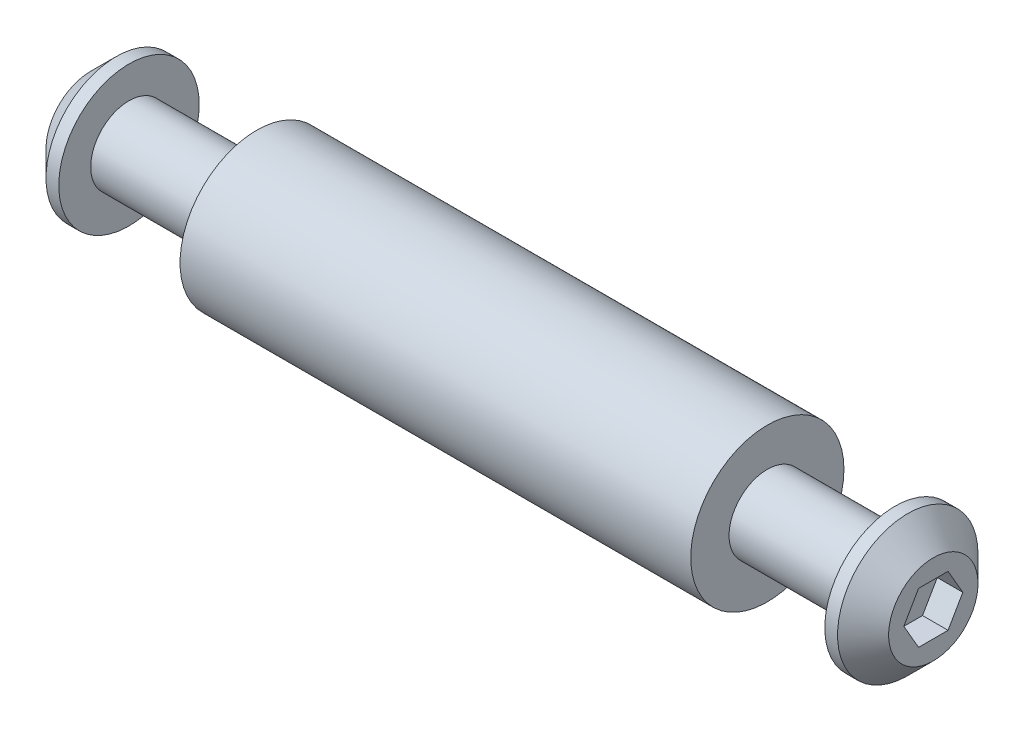
ISO-10303-21;
HEADER;
FILE_DESCRIPTION(('STEP AP214'),'2;1');
FILE_NAME('part.step','',(''),(''),'','','');
FILE_SCHEMA(('AUTOMOTIVE_DESIGN { 1 0 10303 214 1 1 1 1 }'));
ENDSEC;
DATA;
#1=APPLICATION_CONTEXT('core data for automotive mechanical design processes');
#2=APPLICATION_PROTOCOL_DEFINITION('international standard','automotive_design',2000,#1);
#3=PRODUCT_CONTEXT('',#1,'mechanical');
#4=PRODUCT('Part','Part','',(#3));
#5=PRODUCT_RELATED_PRODUCT_CATEGORY('part','',(#4));
#6=PRODUCT_DEFINITION_FORMATION('','',#4);
#7=PRODUCT_DEFINITION_CONTEXT('part definition',#1,'design');
#8=PRODUCT_DEFINITION('design','',#6,#7);
#9=PRODUCT_DEFINITION_SHAPE('','',#8);
#10=(LENGTH_UNIT() NAMED_UNIT(*) SI_UNIT(.MILLI.,.METRE.));
#11=(NAMED_UNIT(*) PLANE_ANGLE_UNIT() SI_UNIT($,.RADIAN.));
#12=(NAMED_UNIT(*) SI_UNIT($,.STERADIAN.) SOLID_ANGLE_UNIT());
#13=UNCERTAINTY_MEASURE_WITH_UNIT(LENGTH_MEASURE(1.E-05),#10,'distance_accuracy_value','');
#14=(GEOMETRIC_REPRESENTATION_CONTEXT(3) GLOBAL_UNCERTAINTY_ASSIGNED_CONTEXT((#13)) GLOBAL_UNIT_ASSIGNED_CONTEXT((#10,
#11,#12)) REPRESENTATION_CONTEXT('',''));
#15=CARTESIAN_POINT('',(0.,0.,0.));
#16=DIRECTION('',(0.,0.,1.));
#17=DIRECTION('',(1.,0.,0.));
#18=AXIS2_PLACEMENT_3D('',#15,#16,#17);
#19=CARTESIAN_POINT('',(-16.5,1.75,0.));
#20=DIRECTION('',(-1.,0.,0.));
#21=DIRECTION('',(0.,0.,1.));
#22=AXIS2_PLACEMENT_3D('',#19,#20,#21);
#23=PLANE('',#22);
#24=CARTESIAN_POINT('',(-16.5,0.,0.));
#25=DIRECTION('',(1.,0.,0.));
#26=DIRECTION('',(0.,0.,-1.));
#27=AXIS2_PLACEMENT_3D('',#24,#25,#26);
#28=CIRCLE('',#27,1.75);
#29=CARTESIAN_POINT('',(-16.5,0.,-1.75));
#30=VERTEX_POINT('',#29);
#31=EDGE_CURVE('E244',#30,#30,#28,.T.);
#32=ORIENTED_EDGE('',*,*,#31,.F.);
#33=EDGE_LOOP('',(#32));
#34=FACE_BOUND('',#33,.T.);
#35=DIRECTION('',(0.,0.866025403784439,-0.5));
#36=VECTOR('',#35,1.);
#37=CARTESIAN_POINT('',(-16.5,-1.,-0.577350269189626));
#38=LINE('',#37,#36);
#39=CARTESIAN_POINT('',(-16.5,-1.,-0.577350269189626));
#40=VERTEX_POINT('',#39);
#41=CARTESIAN_POINT('',(-16.5,0.,-1.15470053837925));
#42=VERTEX_POINT('',#41);
#43=EDGE_CURVE('E155',#40,#42,#38,.T.);
#44=ORIENTED_EDGE('',*,*,#43,.T.);
#45=DIRECTION('',(0.,0.866025403784439,0.5));
#46=VECTOR('',#45,1.);
#47=CARTESIAN_POINT('',(-16.5,0.,-1.15470053837925));
#48=LINE('',#47,#46);
#49=CARTESIAN_POINT('',(-16.5,1.,-0.577350269189626));
#50=VERTEX_POINT('',#49);
#51=EDGE_CURVE('E47',#42,#50,#48,.T.);
#52=ORIENTED_EDGE('',*,*,#51,.T.);
#53=DIRECTION('',(0.,0.,1.));
#54=VECTOR('',#53,1.);
#55=CARTESIAN_POINT('',(-16.5,1.,-0.577350269189626));
#56=LINE('',#55,#54);
#57=CARTESIAN_POINT('',(-16.5,1.,0.577350269189626));
#58=VERTEX_POINT('',#57);
#59=EDGE_CURVE('E142',#50,#58,#56,.T.);
#60=ORIENTED_EDGE('',*,*,#59,.T.);
#61=DIRECTION('',(0.,-0.866025403784438,0.5));
#62=VECTOR('',#61,1.);
#63=CARTESIAN_POINT('',(-16.5,1.,0.577350269189626));
#64=LINE('',#63,#62);
#65=CARTESIAN_POINT('',(-16.5,0.,1.15470053837925));
#66=VERTEX_POINT('',#65);
#67=EDGE_CURVE('E145',#58,#66,#64,.T.);
#68=ORIENTED_EDGE('',*,*,#67,.T.);
#69=DIRECTION('',(0.,-0.866025403784439,-0.5));
#70=VECTOR('',#69,1.);
#71=CARTESIAN_POINT('',(-16.5,0.,1.15470053837925));
#72=LINE('',#71,#70);
#73=CARTESIAN_POINT('',(-16.5,-1.,0.577350269189627));
#74=VERTEX_POINT('',#73);
#75=EDGE_CURVE('E160',#66,#74,#72,.T.);
#76=ORIENTED_EDGE('',*,*,#75,.T.);
#77=DIRECTION('',(0.,0.,-1.));
#78=VECTOR('',#77,1.);
#79=CARTESIAN_POINT('',(-16.5,-1.,0.577350269189627));
#80=LINE('',#79,#78);
#81=EDGE_CURVE('E157',#74,#40,#80,.T.);
#82=ORIENTED_EDGE('',*,*,#81,.T.);
#83=EDGE_LOOP('',(#44,#52,#60,#68,#76,#82));
#84=FACE_BOUND('',#83,.T.);
#85=ADVANCED_FACE('F32',(#34,#84),#23,.T.);
#86=CARTESIAN_POINT('',(15.,1.5,0.));
#87=DIRECTION('',(-1.,0.,0.));
#88=DIRECTION('',(0.,0.,1.));
#89=AXIS2_PLACEMENT_3D('',#86,#87,#88);
#90=PLANE('',#89);
#91=CARTESIAN_POINT('',(15.,0.,0.));
#92=DIRECTION('',(1.,0.,0.));
#93=DIRECTION('',(0.,0.,-1.));
#94=AXIS2_PLACEMENT_3D('',#91,#92,#93);
#95=CIRCLE('',#94,1.5);
#96=CARTESIAN_POINT('',(15.,0.,-1.5));
#97=VERTEX_POINT('',#96);
#98=EDGE_CURVE('E211',#97,#97,#95,.T.);
#99=ORIENTED_EDGE('',*,*,#98,.T.);
#100=EDGE_LOOP('',(#99));
#101=FACE_BOUND('',#100,.T.);
#102=CARTESIAN_POINT('',(15.,0.,0.));
#103=DIRECTION('',(1.,0.,0.));
#104=DIRECTION('',(0.,0.,-1.));
#105=AXIS2_PLACEMENT_3D('',#102,#103,#104);
#106=CIRCLE('',#105,2.75000000000004);
#107=CARTESIAN_POINT('',(15.,0.,-2.75000000000004));
#108=VERTEX_POINT('',#107);
#109=EDGE_CURVE('E11',#108,#108,#106,.T.);
#110=ORIENTED_EDGE('',*,*,#109,.F.);
#111=EDGE_LOOP('',(#110));
#112=FACE_BOUND('',#111,.T.);
#113=ADVANCED_FACE('F34',(#101,#112),#90,.T.);
#114=CARTESIAN_POINT('',(0.,0.,0.));
#115=DIRECTION('',(1.,0.,0.));
#116=DIRECTION('',(0.,0.,-1.));
#117=AXIS2_PLACEMENT_3D('',#114,#115,#116);
#118=CYLINDRICAL_SURFACE('',#117,2.75000000000002);
#119=ORIENTED_EDGE('',*,*,#109,.T.);
#120=EDGE_LOOP('',(#119));
#121=FACE_BOUND('',#120,.T.);
#122=CARTESIAN_POINT('',(15.5,0.,0.));
#123=DIRECTION('',(1.,0.,0.));
#124=DIRECTION('',(0.,0.,-1.));
#125=AXIS2_PLACEMENT_3D('',#122,#123,#124);
#126=CIRCLE('',#125,2.75);
#127=CARTESIAN_POINT('',(15.5,0.,-2.75));
#128=VERTEX_POINT('',#127);
#129=EDGE_CURVE('E40',#128,#128,#126,.T.);
#130=ORIENTED_EDGE('',*,*,#129,.F.);
#131=EDGE_LOOP('',(#130));
#132=FACE_BOUND('',#131,.T.);
#133=ADVANCED_FACE('F255',(#121,#132),#118,.T.);
#134=CARTESIAN_POINT('',(16.5,0.,0.));
#135=DIRECTION('',(-1.,0.,0.));
#136=DIRECTION('',(0.,0.,1.));
#137=AXIS2_PLACEMENT_3D('',#134,#135,#136);
#138=CONICAL_SURFACE('',#137,1.75,0.78539816339745);
#139=ORIENTED_EDGE('',*,*,#129,.T.);
#140=EDGE_LOOP('',(#139));
#141=FACE_BOUND('',#140,.T.);
#142=CARTESIAN_POINT('',(16.5,0.,0.));
#143=DIRECTION('',(1.,0.,0.));
#144=DIRECTION('',(0.,0.,-1.));
#145=AXIS2_PLACEMENT_3D('',#142,#143,#144);
#146=CIRCLE('',#145,1.75);
#147=CARTESIAN_POINT('',(16.5,0.,-1.75));
#148=VERTEX_POINT('',#147);
#149=EDGE_CURVE('E247',#148,#148,#146,.T.);
#150=ORIENTED_EDGE('',*,*,#149,.F.);
#151=EDGE_LOOP('',(#150));
#152=FACE_BOUND('',#151,.T.);
#153=ADVANCED_FACE('F252',(#141,#152),#138,.T.);
#154=CARTESIAN_POINT('',(16.5,1.75,0.));
#155=DIRECTION('',(1.,0.,0.));
#156=DIRECTION('',(0.,0.,-1.));
#157=AXIS2_PLACEMENT_3D('',#154,#155,#156);
#158=PLANE('',#157);
#159=DIRECTION('',(0.,0.866025403784439,0.5));
#160=VECTOR('',#159,1.);
#161=CARTESIAN_POINT('',(16.5,0.,-1.15470053837925));
#162=LINE('',#161,#160);
#163=CARTESIAN_POINT('',(16.5,0.,-1.15470053837925));
#164=VERTEX_POINT('',#163);
#165=CARTESIAN_POINT('',(16.5,1.,-0.577350269189626));
#166=VERTEX_POINT('',#165);
#167=EDGE_CURVE('E55',#164,#166,#162,.T.);
#168=ORIENTED_EDGE('',*,*,#167,.F.);
#169=DIRECTION('',(0.,0.866025403784439,-0.5));
#170=VECTOR('',#169,1.);
#171=CARTESIAN_POINT('',(16.5,-1.,-0.577350269189626));
#172=LINE('',#171,#170);
#173=CARTESIAN_POINT('',(16.5,-1.,-0.577350269189626));
#174=VERTEX_POINT('',#173);
#175=EDGE_CURVE('E178',#174,#164,#172,.T.);
#176=ORIENTED_EDGE('',*,*,#175,.F.);
#177=DIRECTION('',(0.,0.,-1.));
#178=VECTOR('',#177,1.);
#179=CARTESIAN_POINT('',(16.5,-1.,0.577350269189627));
#180=LINE('',#179,#178);
#181=CARTESIAN_POINT('',(16.5,-1.,0.577350269189627));
#182=VERTEX_POINT('',#181);
#183=EDGE_CURVE('E204',#182,#174,#180,.T.);
#184=ORIENTED_EDGE('',*,*,#183,.F.);
#185=DIRECTION('',(0.,-0.866025403784439,-0.5));
#186=VECTOR('',#185,1.);
#187=CARTESIAN_POINT('',(16.5,0.,1.15470053837925));
#188=LINE('',#187,#186);
#189=CARTESIAN_POINT('',(16.5,0.,1.15470053837925));
#190=VERTEX_POINT('',#189);
#191=EDGE_CURVE('E201',#190,#182,#188,.T.);
#192=ORIENTED_EDGE('',*,*,#191,.F.);
#193=DIRECTION('',(0.,-0.866025403784438,0.5));
#194=VECTOR('',#193,1.);
#195=CARTESIAN_POINT('',(16.5,1.,0.577350269189626));
#196=LINE('',#195,#194);
#197=CARTESIAN_POINT('',(16.5,1.,0.577350269189626));
#198=VERTEX_POINT('',#197);
#199=EDGE_CURVE('E198',#198,#190,#196,.T.);
#200=ORIENTED_EDGE('',*,*,#199,.F.);
#201=DIRECTION('',(0.,0.,1.));
#202=VECTOR('',#201,1.);
#203=CARTESIAN_POINT('',(16.5,1.,-0.577350269189626));
#204=LINE('',#203,#202);
#205=EDGE_CURVE('E195',#166,#198,#204,.T.);
#206=ORIENTED_EDGE('',*,*,#205,.F.);
#207=EDGE_LOOP('',(#168,#176,#184,#192,#200,#206));
#208=FACE_BOUND('',#207,.T.);
#209=ORIENTED_EDGE('',*,*,#149,.T.);
#210=EDGE_LOOP('',(#209));
#211=FACE_BOUND('',#210,.T.);
#212=ADVANCED_FACE('F262',(#208,#211),#158,.T.);
#213=CARTESIAN_POINT('',(-15.5,0.,0.));
#214=DIRECTION('',(1.,0.,0.));
#215=DIRECTION('',(0.,0.,-1.));
#216=AXIS2_PLACEMENT_3D('',#213,#214,#215);
#217=CONICAL_SURFACE('',#216,2.75,0.78539816339745);
#218=ORIENTED_EDGE('',*,*,#31,.T.);
#219=EDGE_LOOP('',(#218));
#220=FACE_BOUND('',#219,.T.);
#221=CARTESIAN_POINT('',(-15.5,0.,0.));
#222=DIRECTION('',(1.,0.,0.));
#223=DIRECTION('',(0.,0.,-1.));
#224=AXIS2_PLACEMENT_3D('',#221,#222,#223);
#225=CIRCLE('',#224,2.75);
#226=CARTESIAN_POINT('',(-15.5,0.,-2.75));
#227=VERTEX_POINT('',#226);
#228=EDGE_CURVE('E241',#227,#227,#225,.T.);
#229=ORIENTED_EDGE('',*,*,#228,.F.);
#230=EDGE_LOOP('',(#229));
#231=FACE_BOUND('',#230,.T.);
#232=ADVANCED_FACE('F274',(#220,#231),#217,.T.);
#233=CARTESIAN_POINT('',(0.,0.,0.));
#234=DIRECTION('',(1.,0.,0.));
#235=DIRECTION('',(0.,0.,-1.));
#236=AXIS2_PLACEMENT_3D('',#233,#234,#235);
#237=CYLINDRICAL_SURFACE('',#236,2.75);
#238=ORIENTED_EDGE('',*,*,#228,.T.);
#239=EDGE_LOOP('',(#238));
#240=FACE_BOUND('',#239,.T.);
#241=CARTESIAN_POINT('',(-15.,0.,0.));
#242=DIRECTION('',(1.,0.,0.));
#243=DIRECTION('',(0.,0.,-1.));
#244=AXIS2_PLACEMENT_3D('',#241,#242,#243);
#245=CIRCLE('',#244,2.75);
#246=CARTESIAN_POINT('',(-15.,0.,-2.75));
#247=VERTEX_POINT('',#246);
#248=EDGE_CURVE('E238',#247,#247,#245,.T.);
#249=ORIENTED_EDGE('',*,*,#248,.F.);
#250=EDGE_LOOP('',(#249));
#251=FACE_BOUND('',#250,.T.);
#252=ADVANCED_FACE('F281',(#240,#251),#237,.T.);
#253=CARTESIAN_POINT('',(-15.,1.5,0.));
#254=DIRECTION('',(1.,0.,0.));
#255=DIRECTION('',(0.,0.,-1.));
#256=AXIS2_PLACEMENT_3D('',#253,#254,#255);
#257=PLANE('',#256);
#258=ORIENTED_EDGE('',*,*,#248,.T.);
#259=EDGE_LOOP('',(#258));
#260=FACE_BOUND('',#259,.T.);
#261=CARTESIAN_POINT('',(-15.,0.,0.));
#262=DIRECTION('',(1.,0.,0.));
#263=DIRECTION('',(0.,0.,-1.));
#264=AXIS2_PLACEMENT_3D('',#261,#262,#263);
#265=CIRCLE('',#264,1.5);
#266=CARTESIAN_POINT('',(-15.,0.,-1.5));
#267=VERTEX_POINT('',#266);
#268=EDGE_CURVE('E235',#267,#267,#265,.T.);
#269=ORIENTED_EDGE('',*,*,#268,.F.);
#270=EDGE_LOOP('',(#269));
#271=FACE_BOUND('',#270,.T.);
#272=ADVANCED_FACE('F340',(#260,#271),#257,.T.);
#273=CARTESIAN_POINT('',(0.,0.,0.));
#274=DIRECTION('',(1.,0.,0.));
#275=DIRECTION('',(0.,0.,-1.));
#276=AXIS2_PLACEMENT_3D('',#273,#274,#275);
#277=CYLINDRICAL_SURFACE('',#276,1.5);
#278=ORIENTED_EDGE('',*,*,#268,.T.);
#279=EDGE_LOOP('',(#278));
#280=FACE_BOUND('',#279,.T.);
#281=CARTESIAN_POINT('',(-10.,0.,0.));
#282=DIRECTION('',(1.,0.,0.));
#283=DIRECTION('',(0.,0.,-1.));
#284=AXIS2_PLACEMENT_3D('',#281,#282,#283);
#285=CIRCLE('',#284,1.5);
#286=CARTESIAN_POINT('',(-10.,0.,-1.5));
#287=VERTEX_POINT('',#286);
#288=EDGE_CURVE('E232',#287,#287,#285,.T.);
#289=ORIENTED_EDGE('',*,*,#288,.F.);
#290=EDGE_LOOP('',(#289));
#291=FACE_BOUND('',#290,.T.);
#292=ADVANCED_FACE('F336',(#280,#291),#277,.T.);
#293=CARTESIAN_POINT('',(-10.,3.,0.));
#294=DIRECTION('',(-1.,0.,0.));
#295=DIRECTION('',(0.,0.,1.));
#296=AXIS2_PLACEMENT_3D('',#293,#294,#295);
#297=PLANE('',#296);
#298=ORIENTED_EDGE('',*,*,#288,.T.);
#299=EDGE_LOOP('',(#298));
#300=FACE_BOUND('',#299,.T.);
#301=CARTESIAN_POINT('',(-10.,0.,0.));
#302=DIRECTION('',(1.,0.,0.));
#303=DIRECTION('',(0.,0.,-1.));
#304=AXIS2_PLACEMENT_3D('',#301,#302,#303);
#305=CIRCLE('',#304,3.);
#306=CARTESIAN_POINT('',(-10.,0.,-3.));
#307=VERTEX_POINT('',#306);
#308=EDGE_CURVE('E229',#307,#307,#305,.T.);
#309=ORIENTED_EDGE('',*,*,#308,.F.);
#310=EDGE_LOOP('',(#309));
#311=FACE_BOUND('',#310,.T.);
#312=ADVANCED_FACE('F332',(#300,#311),#297,.T.);
#313=CARTESIAN_POINT('',(0.,0.,0.));
#314=DIRECTION('',(1.,0.,0.));
#315=DIRECTION('',(0.,0.,-1.));
#316=AXIS2_PLACEMENT_3D('',#313,#314,#315);
#317=CYLINDRICAL_SURFACE('',#316,3.);
#318=ORIENTED_EDGE('',*,*,#308,.T.);
#319=EDGE_LOOP('',(#318));
#320=FACE_BOUND('',#319,.T.);
#321=CARTESIAN_POINT('',(10.,0.,0.));
#322=DIRECTION('',(1.,0.,0.));
#323=DIRECTION('',(0.,0.,-1.));
#324=AXIS2_PLACEMENT_3D('',#321,#322,#323);
#325=CIRCLE('',#324,3.);
#326=CARTESIAN_POINT('',(10.,0.,-3.));
#327=VERTEX_POINT('',#326);
#328=EDGE_CURVE('E226',#327,#327,#325,.T.);
#329=ORIENTED_EDGE('',*,*,#328,.F.);
#330=EDGE_LOOP('',(#329));
#331=FACE_BOUND('',#330,.T.);
#332=ADVANCED_FACE('F328',(#320,#331),#317,.T.);
#333=CARTESIAN_POINT('',(10.,3.,0.));
#334=DIRECTION('',(1.,0.,0.));
#335=DIRECTION('',(0.,0.,-1.));
#336=AXIS2_PLACEMENT_3D('',#333,#334,#335);
#337=PLANE('',#336);
#338=ORIENTED_EDGE('',*,*,#328,.T.);
#339=EDGE_LOOP('',(#338));
#340=FACE_BOUND('',#339,.T.);
#341=CARTESIAN_POINT('',(10.,0.,0.));
#342=DIRECTION('',(1.,0.,0.));
#343=DIRECTION('',(0.,0.,-1.));
#344=AXIS2_PLACEMENT_3D('',#341,#342,#343);
#345=CIRCLE('',#344,1.5);
#346=CARTESIAN_POINT('',(10.,0.,-1.5));
#347=VERTEX_POINT('',#346);
#348=EDGE_CURVE('E223',#347,#347,#345,.T.);
#349=ORIENTED_EDGE('',*,*,#348,.F.);
#350=EDGE_LOOP('',(#349));
#351=FACE_BOUND('',#350,.T.);
#352=ADVANCED_FACE('F324',(#340,#351),#337,.T.);
#353=CARTESIAN_POINT('',(0.,0.,0.));
#354=DIRECTION('',(1.,0.,0.));
#355=DIRECTION('',(0.,0.,-1.));
#356=AXIS2_PLACEMENT_3D('',#353,#354,#355);
#357=CYLINDRICAL_SURFACE('',#356,1.5);
#358=ORIENTED_EDGE('',*,*,#348,.T.);
#359=EDGE_LOOP('',(#358));
#360=FACE_BOUND('',#359,.T.);
#361=ORIENTED_EDGE('',*,*,#98,.F.);
#362=EDGE_LOOP('',(#361));
#363=FACE_BOUND('',#362,.T.);
#364=ADVANCED_FACE('F321',(#360,#363),#357,.T.);
#365=CARTESIAN_POINT('',(15.5,0.,-1.15470053837925));
#366=DIRECTION('',(0.,0.5,-0.866025403784439));
#367=DIRECTION('',(0.,0.866025403784439,0.5));
#368=AXIS2_PLACEMENT_3D('',#365,#366,#367);
#369=PLANE('',#368);
#370=ORIENTED_EDGE('',*,*,#167,.T.);
#371=DIRECTION('',(1.,0.,0.));
#372=VECTOR('',#371,1.);
#373=CARTESIAN_POINT('',(15.5,1.,-0.577350269189626));
#374=LINE('',#373,#372);
#375=CARTESIAN_POINT('',(15.5,1.,-0.577350269189626));
#376=VERTEX_POINT('',#375);
#377=EDGE_CURVE('E193',#376,#166,#374,.T.);
#378=ORIENTED_EDGE('',*,*,#377,.F.);
#379=DIRECTION('',(0.,0.866025403784439,0.5));
#380=VECTOR('',#379,1.);
#381=CARTESIAN_POINT('',(15.5,0.,-1.15470053837925));
#382=LINE('',#381,#380);
#383=CARTESIAN_POINT('',(15.5,0.,-1.15470053837925));
#384=VERTEX_POINT('',#383);
#385=EDGE_CURVE('E174',#384,#376,#382,.T.);
#386=ORIENTED_EDGE('',*,*,#385,.F.);
#387=DIRECTION('',(1.,0.,0.));
#388=VECTOR('',#387,1.);
#389=CARTESIAN_POINT('',(15.5,0.,-1.15470053837925));
#390=LINE('',#389,#388);
#391=EDGE_CURVE('E209',#384,#164,#390,.T.);
#392=ORIENTED_EDGE('',*,*,#391,.T.);
#393=EDGE_LOOP('',(#370,#378,#386,#392));
#394=FACE_BOUND('',#393,.T.);
#395=ADVANCED_FACE('F295',(#394),#369,.F.);
#396=CARTESIAN_POINT('',(15.5,-1.,-0.577350269189626));
#397=DIRECTION('',(0.,-0.5,-0.866025403784439));
#398=DIRECTION('',(0.,0.866025403784439,-0.5));
#399=AXIS2_PLACEMENT_3D('',#396,#397,#398);
#400=PLANE('',#399);
#401=ORIENTED_EDGE('',*,*,#175,.T.);
#402=ORIENTED_EDGE('',*,*,#391,.F.);
#403=DIRECTION('',(0.,0.866025403784439,-0.5));
#404=VECTOR('',#403,1.);
#405=CARTESIAN_POINT('',(15.5,-1.,-0.577350269189626));
#406=LINE('',#405,#404);
#407=CARTESIAN_POINT('',(15.5,-1.,-0.577350269189626));
#408=VERTEX_POINT('',#407);
#409=EDGE_CURVE('E190',#408,#384,#406,.T.);
#410=ORIENTED_EDGE('',*,*,#409,.F.);
#411=DIRECTION('',(1.,0.,0.));
#412=VECTOR('',#411,1.);
#413=CARTESIAN_POINT('',(15.5,-1.,-0.577350269189626));
#414=LINE('',#413,#412);
#415=EDGE_CURVE('E212',#408,#174,#414,.T.);
#416=ORIENTED_EDGE('',*,*,#415,.T.);
#417=EDGE_LOOP('',(#401,#402,#410,#416));
#418=FACE_BOUND('',#417,.T.);
#419=ADVANCED_FACE('F301',(#418),#400,.F.);
#420=CARTESIAN_POINT('',(15.5,-1.,0.577350269189627));
#421=DIRECTION('',(0.,-1.,0.));
#422=DIRECTION('',(0.,0.,-1.));
#423=AXIS2_PLACEMENT_3D('',#420,#421,#422);
#424=PLANE('',#423);
#425=ORIENTED_EDGE('',*,*,#183,.T.);
#426=ORIENTED_EDGE('',*,*,#415,.F.);
#427=DIRECTION('',(0.,0.,-1.));
#428=VECTOR('',#427,1.);
#429=CARTESIAN_POINT('',(15.5,-1.,0.577350269189627));
#430=LINE('',#429,#428);
#431=CARTESIAN_POINT('',(15.5,-1.,0.577350269189627));
#432=VERTEX_POINT('',#431);
#433=EDGE_CURVE('E187',#432,#408,#430,.T.);
#434=ORIENTED_EDGE('',*,*,#433,.F.);
#435=DIRECTION('',(1.,0.,0.));
#436=VECTOR('',#435,1.);
#437=CARTESIAN_POINT('',(15.5,-1.,0.577350269189627));
#438=LINE('',#437,#436);
#439=EDGE_CURVE('E214',#432,#182,#438,.T.);
#440=ORIENTED_EDGE('',*,*,#439,.T.);
#441=EDGE_LOOP('',(#425,#426,#434,#440));
#442=FACE_BOUND('',#441,.T.);
#443=ADVANCED_FACE('F303',(#442),#424,.F.);
#444=CARTESIAN_POINT('',(15.5,0.,1.15470053837925));
#445=DIRECTION('',(0.,-0.5,0.866025403784439));
#446=DIRECTION('',(0.,-0.866025403784439,-0.5));
#447=AXIS2_PLACEMENT_3D('',#444,#445,#446);
#448=PLANE('',#447);
#449=ORIENTED_EDGE('',*,*,#191,.T.);
#450=ORIENTED_EDGE('',*,*,#439,.F.);
#451=DIRECTION('',(0.,-0.866025403784439,-0.5));
#452=VECTOR('',#451,1.);
#453=CARTESIAN_POINT('',(15.5,0.,1.15470053837925));
#454=LINE('',#453,#452);
#455=CARTESIAN_POINT('',(15.5,0.,1.15470053837925));
#456=VERTEX_POINT('',#455);
#457=EDGE_CURVE('E184',#456,#432,#454,.T.);
#458=ORIENTED_EDGE('',*,*,#457,.F.);
#459=DIRECTION('',(1.,0.,0.));
#460=VECTOR('',#459,1.);
#461=CARTESIAN_POINT('',(15.5,0.,1.15470053837925));
#462=LINE('',#461,#460);
#463=EDGE_CURVE('E216',#456,#190,#462,.T.);
#464=ORIENTED_EDGE('',*,*,#463,.T.);
#465=EDGE_LOOP('',(#449,#450,#458,#464));
#466=FACE_BOUND('',#465,.T.);
#467=ADVANCED_FACE('F305',(#466),#448,.F.);
#468=CARTESIAN_POINT('',(15.5,1.,0.577350269189626));
#469=DIRECTION('',(0.,0.5,0.866025403784438));
#470=DIRECTION('',(0.,-0.866025403784439,0.5));
#471=AXIS2_PLACEMENT_3D('',#468,#469,#470);
#472=PLANE('',#471);
#473=ORIENTED_EDGE('',*,*,#199,.T.);
#474=ORIENTED_EDGE('',*,*,#463,.F.);
#475=DIRECTION('',(0.,-0.866025403784438,0.5));
#476=VECTOR('',#475,1.);
#477=CARTESIAN_POINT('',(15.5,1.,0.577350269189626));
#478=LINE('',#477,#476);
#479=CARTESIAN_POINT('',(15.5,1.,0.577350269189626));
#480=VERTEX_POINT('',#479);
#481=EDGE_CURVE('E181',#480,#456,#478,.T.);
#482=ORIENTED_EDGE('',*,*,#481,.F.);
#483=DIRECTION('',(1.,0.,0.));
#484=VECTOR('',#483,1.);
#485=CARTESIAN_POINT('',(15.5,1.,0.577350269189626));
#486=LINE('',#485,#484);
#487=EDGE_CURVE('E218',#480,#198,#486,.T.);
#488=ORIENTED_EDGE('',*,*,#487,.T.);
#489=EDGE_LOOP('',(#473,#474,#482,#488));
#490=FACE_BOUND('',#489,.T.);
#491=ADVANCED_FACE('F308',(#490),#472,.F.);
#492=CARTESIAN_POINT('',(15.5,1.,-0.577350269189626));
#493=DIRECTION('',(0.,1.,0.));
#494=DIRECTION('',(0.,0.,1.));
#495=AXIS2_PLACEMENT_3D('',#492,#493,#494);
#496=PLANE('',#495);
#497=ORIENTED_EDGE('',*,*,#205,.T.);
#498=ORIENTED_EDGE('',*,*,#487,.F.);
#499=DIRECTION('',(0.,0.,1.));
#500=VECTOR('',#499,1.);
#501=CARTESIAN_POINT('',(15.5,1.,-0.577350269189626));
#502=LINE('',#501,#500);
#503=EDGE_CURVE('E177',#376,#480,#502,.T.);
#504=ORIENTED_EDGE('',*,*,#503,.F.);
#505=ORIENTED_EDGE('',*,*,#377,.T.);
#506=EDGE_LOOP('',(#497,#498,#504,#505));
#507=FACE_BOUND('',#506,.T.);
#508=ADVANCED_FACE('F291',(#507),#496,.F.);
#509=CARTESIAN_POINT('',(15.5,0.,0.));
#510=DIRECTION('',(1.,0.,0.));
#511=DIRECTION('',(0.,0.,-1.));
#512=AXIS2_PLACEMENT_3D('',#509,#510,#511);
#513=PLANE('',#512);
#514=ORIENTED_EDGE('',*,*,#385,.T.);
#515=ORIENTED_EDGE('',*,*,#503,.T.);
#516=ORIENTED_EDGE('',*,*,#481,.T.);
#517=ORIENTED_EDGE('',*,*,#457,.T.);
#518=ORIENTED_EDGE('',*,*,#433,.T.);
#519=ORIENTED_EDGE('',*,*,#409,.T.);
#520=EDGE_LOOP('',(#514,#515,#516,#517,#518,#519));
#521=FACE_BOUND('',#520,.T.);
#522=ADVANCED_FACE('F298',(#521),#513,.T.);
#523=CARTESIAN_POINT('',(-15.5,0.,-1.15470053837925));
#524=DIRECTION('',(0.,-0.5,0.866025403784439));
#525=DIRECTION('',(0.,-0.866025403784439,-0.5));
#526=AXIS2_PLACEMENT_3D('',#523,#524,#525);
#527=PLANE('',#526);
#528=ORIENTED_EDGE('',*,*,#51,.F.);
#529=DIRECTION('',(-1.,0.,0.));
#530=VECTOR('',#529,1.);
#531=CARTESIAN_POINT('',(-15.5,0.,-1.15470053837925));
#532=LINE('',#531,#530);
#533=CARTESIAN_POINT('',(-15.5,0.,-1.15470053837925));
#534=VERTEX_POINT('',#533);
#535=EDGE_CURVE('E126',#534,#42,#532,.T.);
#536=ORIENTED_EDGE('',*,*,#535,.F.);
#537=DIRECTION('',(0.,0.866025403784439,0.5));
#538=VECTOR('',#537,1.);
#539=CARTESIAN_POINT('',(-15.5,0.,-1.15470053837925));
#540=LINE('',#539,#538);
#541=CARTESIAN_POINT('',(-15.5,1.,-0.577350269189626));
#542=VERTEX_POINT('',#541);
#543=EDGE_CURVE('E133',#534,#542,#540,.T.);
#544=ORIENTED_EDGE('',*,*,#543,.T.);
#545=DIRECTION('',(-1.,0.,0.));
#546=VECTOR('',#545,1.);
#547=CARTESIAN_POINT('',(-15.5,1.,-0.577350269189626));
#548=LINE('',#547,#546);
#549=EDGE_CURVE('E165',#542,#50,#548,.T.);
#550=ORIENTED_EDGE('',*,*,#549,.T.);
#551=EDGE_LOOP('',(#528,#536,#544,#550));
#552=FACE_BOUND('',#551,.T.);
#553=ADVANCED_FACE('F136',(#552),#527,.T.);
#554=CARTESIAN_POINT('',(-15.5,1.,-0.577350269189626));
#555=DIRECTION('',(0.,-1.,0.));
#556=DIRECTION('',(0.,0.,-1.));
#557=AXIS2_PLACEMENT_3D('',#554,#555,#556);
#558=PLANE('',#557);
#559=ORIENTED_EDGE('',*,*,#59,.F.);
#560=ORIENTED_EDGE('',*,*,#549,.F.);
#561=DIRECTION('',(0.,0.,1.));
#562=VECTOR('',#561,1.);
#563=CARTESIAN_POINT('',(-15.5,1.,-0.577350269189626));
#564=LINE('',#563,#562);
#565=CARTESIAN_POINT('',(-15.5,1.,0.577350269189626));
#566=VERTEX_POINT('',#565);
#567=EDGE_CURVE('E138',#542,#566,#564,.T.);
#568=ORIENTED_EDGE('',*,*,#567,.T.);
#569=DIRECTION('',(-1.,0.,0.));
#570=VECTOR('',#569,1.);
#571=CARTESIAN_POINT('',(-15.5,1.,0.577350269189626));
#572=LINE('',#571,#570);
#573=EDGE_CURVE('E167',#566,#58,#572,.T.);
#574=ORIENTED_EDGE('',*,*,#573,.T.);
#575=EDGE_LOOP('',(#559,#560,#568,#574));
#576=FACE_BOUND('',#575,.T.);
#577=ADVANCED_FACE('F442',(#576),#558,.T.);
#578=CARTESIAN_POINT('',(-15.5,1.,0.577350269189626));
#579=DIRECTION('',(0.,-0.5,-0.866025403784438));
#580=DIRECTION('',(0.,0.866025403784439,-0.5));
#581=AXIS2_PLACEMENT_3D('',#578,#579,#580);
#582=PLANE('',#581);
#583=ORIENTED_EDGE('',*,*,#67,.F.);
#584=ORIENTED_EDGE('',*,*,#573,.F.);
#585=DIRECTION('',(0.,-0.866025403784438,0.5));
#586=VECTOR('',#585,1.);
#587=CARTESIAN_POINT('',(-15.5,1.,0.577350269189626));
#588=LINE('',#587,#586);
#589=CARTESIAN_POINT('',(-15.5,0.,1.15470053837925));
#590=VERTEX_POINT('',#589);
#591=EDGE_CURVE('E151',#566,#590,#588,.T.);
#592=ORIENTED_EDGE('',*,*,#591,.T.);
#593=DIRECTION('',(-1.,0.,0.));
#594=VECTOR('',#593,1.);
#595=CARTESIAN_POINT('',(-15.5,0.,1.15470053837925));
#596=LINE('',#595,#594);
#597=EDGE_CURVE('E169',#590,#66,#596,.T.);
#598=ORIENTED_EDGE('',*,*,#597,.T.);
#599=EDGE_LOOP('',(#583,#584,#592,#598));
#600=FACE_BOUND('',#599,.T.);
#601=ADVANCED_FACE('F451',(#600),#582,.T.);
#602=CARTESIAN_POINT('',(-15.5,0.,1.15470053837925));
#603=DIRECTION('',(0.,0.5,-0.866025403784439));
#604=DIRECTION('',(0.,0.866025403784439,0.5));
#605=AXIS2_PLACEMENT_3D('',#602,#603,#604);
#606=PLANE('',#605);
#607=ORIENTED_EDGE('',*,*,#75,.F.);
#608=ORIENTED_EDGE('',*,*,#597,.F.);
#609=DIRECTION('',(0.,-0.866025403784439,-0.5));
#610=VECTOR('',#609,1.);
#611=CARTESIAN_POINT('',(-15.5,0.,1.15470053837925));
#612=LINE('',#611,#610);
#613=CARTESIAN_POINT('',(-15.5,-1.,0.577350269189627));
#614=VERTEX_POINT('',#613);
#615=EDGE_CURVE('E149',#590,#614,#612,.T.);
#616=ORIENTED_EDGE('',*,*,#615,.T.);
#617=DIRECTION('',(-1.,0.,0.));
#618=VECTOR('',#617,1.);
#619=CARTESIAN_POINT('',(-15.5,-1.,0.577350269189627));
#620=LINE('',#619,#618);
#621=EDGE_CURVE('E171',#614,#74,#620,.T.);
#622=ORIENTED_EDGE('',*,*,#621,.T.);
#623=EDGE_LOOP('',(#607,#608,#616,#622));
#624=FACE_BOUND('',#623,.T.);
#625=ADVANCED_FACE('F461',(#624),#606,.T.);
#626=CARTESIAN_POINT('',(-15.5,-1.,0.577350269189627));
#627=DIRECTION('',(0.,1.,0.));
#628=DIRECTION('',(0.,0.,1.));
#629=AXIS2_PLACEMENT_3D('',#626,#627,#628);
#630=PLANE('',#629);
#631=ORIENTED_EDGE('',*,*,#81,.F.);
#632=ORIENTED_EDGE('',*,*,#621,.F.);
#633=DIRECTION('',(0.,0.,-1.));
#634=VECTOR('',#633,1.);
#635=CARTESIAN_POINT('',(-15.5,-1.,0.577350269189627));
#636=LINE('',#635,#634);
#637=CARTESIAN_POINT('',(-15.5,-1.,-0.577350269189626));
#638=VERTEX_POINT('',#637);
#639=EDGE_CURVE('E132',#614,#638,#636,.T.);
#640=ORIENTED_EDGE('',*,*,#639,.T.);
#641=DIRECTION('',(-1.,0.,0.));
#642=VECTOR('',#641,1.);
#643=CARTESIAN_POINT('',(-15.5,-1.,-0.577350269189626));
#644=LINE('',#643,#642);
#645=EDGE_CURVE('E128',#638,#40,#644,.T.);
#646=ORIENTED_EDGE('',*,*,#645,.T.);
#647=EDGE_LOOP('',(#631,#632,#640,#646));
#648=FACE_BOUND('',#647,.T.);
#649=ADVANCED_FACE('F471',(#648),#630,.T.);
#650=CARTESIAN_POINT('',(-15.5,-1.,-0.577350269189626));
#651=DIRECTION('',(0.,0.5,0.866025403784439));
#652=DIRECTION('',(0.,-0.866025403784439,0.5));
#653=AXIS2_PLACEMENT_3D('',#650,#651,#652);
#654=PLANE('',#653);
#655=ORIENTED_EDGE('',*,*,#43,.F.);
#656=ORIENTED_EDGE('',*,*,#645,.F.);
#657=DIRECTION('',(0.,0.866025403784439,-0.5));
#658=VECTOR('',#657,1.);
#659=CARTESIAN_POINT('',(-15.5,-1.,-0.577350269189626));
#660=LINE('',#659,#658);
#661=EDGE_CURVE('E123',#638,#534,#660,.T.);
#662=ORIENTED_EDGE('',*,*,#661,.T.);
#663=ORIENTED_EDGE('',*,*,#535,.T.);
#664=EDGE_LOOP('',(#655,#656,#662,#663));
#665=FACE_BOUND('',#664,.T.);
#666=ADVANCED_FACE('F125',(#665),#654,.T.);
#667=CARTESIAN_POINT('',(-15.5,0.,0.));
#668=DIRECTION('',(-1.,0.,0.));
#669=DIRECTION('',(0.,0.,-1.));
#670=AXIS2_PLACEMENT_3D('',#667,#668,#669);
#671=PLANE('',#670);
#672=ORIENTED_EDGE('',*,*,#543,.F.);
#673=ORIENTED_EDGE('',*,*,#661,.F.);
#674=ORIENTED_EDGE('',*,*,#639,.F.);
#675=ORIENTED_EDGE('',*,*,#615,.F.);
#676=ORIENTED_EDGE('',*,*,#591,.F.);
#677=ORIENTED_EDGE('',*,*,#567,.F.);
#678=EDGE_LOOP('',(#672,#673,#674,#675,#676,#677));
#679=FACE_BOUND('',#678,.T.);
#680=ADVANCED_FACE('F140',(#679),#671,.T.);
#681=CLOSED_SHELL('',(#85,#113,#133,#153,#212,#232,#252,#272,#292,#312,#332,#352,#364,#395,#419,
#443,#467,#491,#508,#522,#553,#577,#601,#625,#649,#666,#680));
#682=MANIFOLD_SOLID_BREP('B2',#681);
#683=ADVANCED_BREP_SHAPE_REPRESENTATION('',(#18,#682),#14);
#684=SHAPE_DEFINITION_REPRESENTATION(#9,#683);
ENDSEC;
END-ISO-10303-21;
